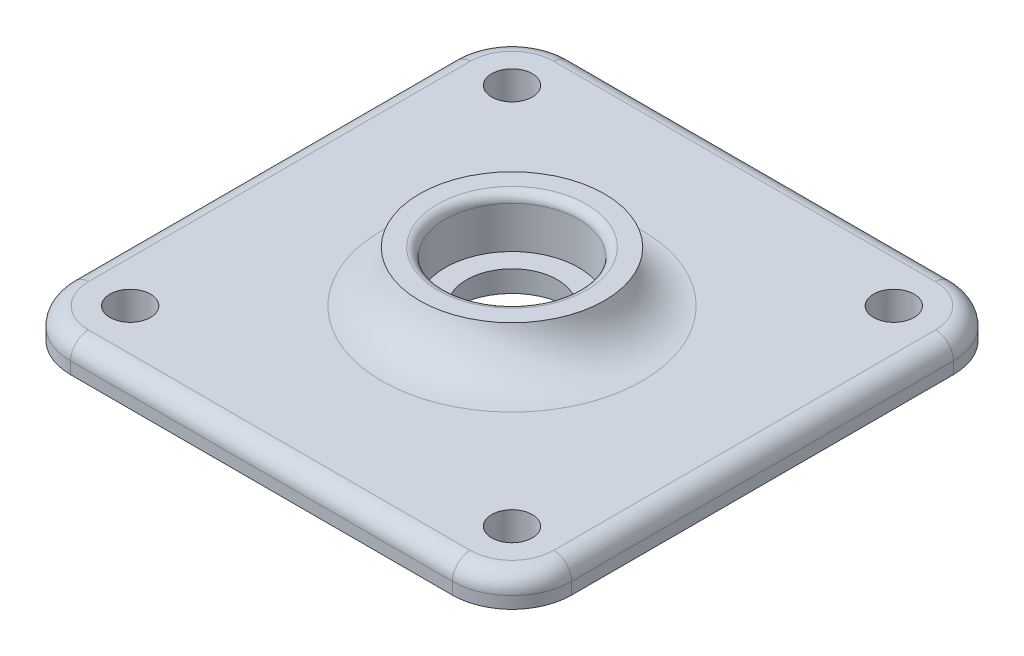
ISO-10303-21;
HEADER;
FILE_DESCRIPTION(('STEP AP214'),'2;1');
FILE_NAME('part.step','',(''),(''),'','','');
FILE_SCHEMA(('AUTOMOTIVE_DESIGN { 1 0 10303 214 1 1 1 1 }'));
ENDSEC;
DATA;
#1=APPLICATION_CONTEXT('core data for automotive mechanical design processes');
#2=APPLICATION_PROTOCOL_DEFINITION('international standard','automotive_design',2000,#1);
#3=PRODUCT_CONTEXT('',#1,'mechanical');
#4=PRODUCT('Part','Part','',(#3));
#5=PRODUCT_RELATED_PRODUCT_CATEGORY('part','',(#4));
#6=PRODUCT_DEFINITION_FORMATION('','',#4);
#7=PRODUCT_DEFINITION_CONTEXT('part definition',#1,'design');
#8=PRODUCT_DEFINITION('design','',#6,#7);
#9=PRODUCT_DEFINITION_SHAPE('','',#8);
#10=(LENGTH_UNIT() NAMED_UNIT(*) SI_UNIT(.MILLI.,.METRE.));
#11=(NAMED_UNIT(*) PLANE_ANGLE_UNIT() SI_UNIT($,.RADIAN.));
#12=(NAMED_UNIT(*) SI_UNIT($,.STERADIAN.) SOLID_ANGLE_UNIT());
#13=UNCERTAINTY_MEASURE_WITH_UNIT(LENGTH_MEASURE(1.E-05),#10,'distance_accuracy_value','');
#14=(GEOMETRIC_REPRESENTATION_CONTEXT(3) GLOBAL_UNCERTAINTY_ASSIGNED_CONTEXT((#13)) GLOBAL_UNIT_ASSIGNED_CONTEXT((#10,
#11,#12)) REPRESENTATION_CONTEXT('',''));
#15=CARTESIAN_POINT('',(0.,0.,0.));
#16=DIRECTION('',(0.,0.,1.));
#17=DIRECTION('',(1.,0.,0.));
#18=AXIS2_PLACEMENT_3D('',#15,#16,#17);
#19=CARTESIAN_POINT('',(32.,5.,-32.));
#20=DIRECTION('',(0.,-1.,0.));
#21=DIRECTION('',(0.,0.,-1.));
#22=AXIS2_PLACEMENT_3D('',#19,#20,#21);
#23=CYLINDRICAL_SURFACE('',#22,10.);
#24=DIRECTION('',(0.,-1.,0.));
#25=VECTOR('',#24,1.);
#26=CARTESIAN_POINT('',(32.,5.,-42.));
#27=LINE('',#26,#25);
#28=CARTESIAN_POINT('',(32.,2.,-42.));
#29=VERTEX_POINT('',#28);
#30=CARTESIAN_POINT('',(32.,0.,-42.));
#31=VERTEX_POINT('',#30);
#32=EDGE_CURVE('E187',#29,#31,#27,.T.);
#33=ORIENTED_EDGE('',*,*,#32,.F.);
#34=CARTESIAN_POINT('',(32.,2.,-32.));
#35=DIRECTION('',(0.,-1.,0.));
#36=DIRECTION('',(0.,0.,-1.));
#37=AXIS2_PLACEMENT_3D('',#34,#35,#36);
#38=CIRCLE('',#37,10.);
#39=CARTESIAN_POINT('',(42.,2.,-32.));
#40=VERTEX_POINT('',#39);
#41=EDGE_CURVE('E137',#29,#40,#38,.T.);
#42=ORIENTED_EDGE('',*,*,#41,.T.);
#43=DIRECTION('',(0.,-1.,0.));
#44=VECTOR('',#43,1.);
#45=CARTESIAN_POINT('',(42.,5.,-32.));
#46=LINE('',#45,#44);
#47=CARTESIAN_POINT('',(42.,0.,-32.));
#48=VERTEX_POINT('',#47);
#49=EDGE_CURVE('E131',#40,#48,#46,.T.);
#50=ORIENTED_EDGE('',*,*,#49,.T.);
#51=CARTESIAN_POINT('',(32.,0.,-32.));
#52=DIRECTION('',(0.,-1.,0.));
#53=DIRECTION('',(0.,0.,-1.));
#54=AXIS2_PLACEMENT_3D('',#51,#52,#53);
#55=CIRCLE('',#54,10.);
#56=EDGE_CURVE('E135',#31,#48,#55,.T.);
#57=ORIENTED_EDGE('',*,*,#56,.F.);
#58=EDGE_LOOP('',(#33,#42,#50,#57));
#59=FACE_BOUND('',#58,.T.);
#60=ADVANCED_FACE('F41',(#59),#23,.T.);
#61=CARTESIAN_POINT('',(32.,5.,-42.));
#62=DIRECTION('',(0.,0.,1.));
#63=DIRECTION('',(1.,0.,0.));
#64=AXIS2_PLACEMENT_3D('',#61,#62,#63);
#65=PLANE('',#64);
#66=DIRECTION('',(0.,-1.,0.));
#67=VECTOR('',#66,1.);
#68=CARTESIAN_POINT('',(-32.,5.,-42.));
#69=LINE('',#68,#67);
#70=CARTESIAN_POINT('',(-32.,2.,-42.));
#71=VERTEX_POINT('',#70);
#72=CARTESIAN_POINT('',(-32.,0.,-42.));
#73=VERTEX_POINT('',#72);
#74=EDGE_CURVE('E191',#71,#73,#69,.T.);
#75=ORIENTED_EDGE('',*,*,#74,.F.);
#76=DIRECTION('',(-1.,0.,0.));
#77=VECTOR('',#76,1.);
#78=CARTESIAN_POINT('',(32.,2.,-42.));
#79=LINE('',#78,#77);
#80=EDGE_CURVE('E238',#71,#29,#79,.F.);
#81=ORIENTED_EDGE('',*,*,#80,.T.);
#82=ORIENTED_EDGE('',*,*,#32,.T.);
#83=DIRECTION('',(-1.,0.,0.));
#84=VECTOR('',#83,1.);
#85=CARTESIAN_POINT('',(32.,0.,-42.));
#86=LINE('',#85,#84);
#87=EDGE_CURVE('E143',#31,#73,#86,.T.);
#88=ORIENTED_EDGE('',*,*,#87,.T.);
#89=EDGE_LOOP('',(#75,#81,#82,#88));
#90=FACE_BOUND('',#89,.T.);
#91=ADVANCED_FACE('F342',(#90),#65,.F.);
#92=CARTESIAN_POINT('',(-32.,5.,-32.));
#93=DIRECTION('',(0.,-1.,0.));
#94=DIRECTION('',(0.,0.,-1.));
#95=AXIS2_PLACEMENT_3D('',#92,#93,#94);
#96=CYLINDRICAL_SURFACE('',#95,10.);
#97=DIRECTION('',(0.,-1.,0.));
#98=VECTOR('',#97,1.);
#99=CARTESIAN_POINT('',(-42.,5.,-32.));
#100=LINE('',#99,#98);
#101=CARTESIAN_POINT('',(-42.,2.,-32.));
#102=VERTEX_POINT('',#101);
#103=CARTESIAN_POINT('',(-42.,0.,-32.));
#104=VERTEX_POINT('',#103);
#105=EDGE_CURVE('E194',#102,#104,#100,.T.);
#106=ORIENTED_EDGE('',*,*,#105,.F.);
#107=CARTESIAN_POINT('',(-32.,2.,-32.));
#108=DIRECTION('',(0.,-1.,0.));
#109=DIRECTION('',(0.,0.,-1.));
#110=AXIS2_PLACEMENT_3D('',#107,#108,#109);
#111=CIRCLE('',#110,10.);
#112=EDGE_CURVE('E241',#102,#71,#111,.T.);
#113=ORIENTED_EDGE('',*,*,#112,.T.);
#114=ORIENTED_EDGE('',*,*,#74,.T.);
#115=CARTESIAN_POINT('',(-32.,0.,-32.));
#116=DIRECTION('',(0.,1.,0.));
#117=DIRECTION('',(0.,0.,1.));
#118=AXIS2_PLACEMENT_3D('',#115,#116,#117);
#119=CIRCLE('',#118,10.);
#120=EDGE_CURVE('E181',#73,#104,#119,.T.);
#121=ORIENTED_EDGE('',*,*,#120,.T.);
#122=EDGE_LOOP('',(#106,#113,#114,#121));
#123=FACE_BOUND('',#122,.T.);
#124=ADVANCED_FACE('F347',(#123),#96,.T.);
#125=CARTESIAN_POINT('',(-42.,5.,-32.));
#126=DIRECTION('',(1.,0.,0.));
#127=DIRECTION('',(0.,0.,-1.));
#128=AXIS2_PLACEMENT_3D('',#125,#126,#127);
#129=PLANE('',#128);
#130=DIRECTION('',(0.,-1.,0.));
#131=VECTOR('',#130,1.);
#132=CARTESIAN_POINT('',(-42.,5.,32.));
#133=LINE('',#132,#131);
#134=CARTESIAN_POINT('',(-42.,2.,32.));
#135=VERTEX_POINT('',#134);
#136=CARTESIAN_POINT('',(-42.,0.,32.));
#137=VERTEX_POINT('',#136);
#138=EDGE_CURVE('E197',#135,#137,#133,.T.);
#139=ORIENTED_EDGE('',*,*,#138,.F.);
#140=DIRECTION('',(0.,0.,1.));
#141=VECTOR('',#140,1.);
#142=CARTESIAN_POINT('',(-42.,2.,-32.));
#143=LINE('',#142,#141);
#144=EDGE_CURVE('E244',#135,#102,#143,.F.);
#145=ORIENTED_EDGE('',*,*,#144,.T.);
#146=ORIENTED_EDGE('',*,*,#105,.T.);
#147=DIRECTION('',(0.,0.,1.));
#148=VECTOR('',#147,1.);
#149=CARTESIAN_POINT('',(-42.,0.,-32.));
#150=LINE('',#149,#148);
#151=EDGE_CURVE('E177',#104,#137,#150,.T.);
#152=ORIENTED_EDGE('',*,*,#151,.T.);
#153=EDGE_LOOP('',(#139,#145,#146,#152));
#154=FACE_BOUND('',#153,.T.);
#155=ADVANCED_FACE('F407',(#154),#129,.F.);
#156=CARTESIAN_POINT('',(-32.,5.,32.));
#157=DIRECTION('',(0.,-1.,0.));
#158=DIRECTION('',(0.,0.,-1.));
#159=AXIS2_PLACEMENT_3D('',#156,#157,#158);
#160=CYLINDRICAL_SURFACE('',#159,10.);
#161=DIRECTION('',(0.,-1.,0.));
#162=VECTOR('',#161,1.);
#163=CARTESIAN_POINT('',(-32.,5.,42.));
#164=LINE('',#163,#162);
#165=CARTESIAN_POINT('',(-32.,2.,42.));
#166=VERTEX_POINT('',#165);
#167=CARTESIAN_POINT('',(-32.,0.,42.));
#168=VERTEX_POINT('',#167);
#169=EDGE_CURVE('E200',#166,#168,#164,.T.);
#170=ORIENTED_EDGE('',*,*,#169,.F.);
#171=CARTESIAN_POINT('',(-32.,2.,32.));
#172=DIRECTION('',(0.,-1.,0.));
#173=DIRECTION('',(0.,0.,-1.));
#174=AXIS2_PLACEMENT_3D('',#171,#172,#173);
#175=CIRCLE('',#174,10.);
#176=EDGE_CURVE('E247',#166,#135,#175,.T.);
#177=ORIENTED_EDGE('',*,*,#176,.T.);
#178=ORIENTED_EDGE('',*,*,#138,.T.);
#179=CARTESIAN_POINT('',(-32.,0.,32.));
#180=DIRECTION('',(0.,-1.,0.));
#181=DIRECTION('',(0.,0.,-1.));
#182=AXIS2_PLACEMENT_3D('',#179,#180,#181);
#183=CIRCLE('',#182,10.);
#184=EDGE_CURVE('E173',#168,#137,#183,.T.);
#185=ORIENTED_EDGE('',*,*,#184,.F.);
#186=EDGE_LOOP('',(#170,#177,#178,#185));
#187=FACE_BOUND('',#186,.T.);
#188=ADVANCED_FACE('F410',(#187),#160,.T.);
#189=CARTESIAN_POINT('',(32.,5.,42.));
#190=DIRECTION('',(0.,0.,1.));
#191=DIRECTION('',(1.,0.,0.));
#192=AXIS2_PLACEMENT_3D('',#189,#190,#191);
#193=PLANE('',#192);
#194=DIRECTION('',(0.,-1.,0.));
#195=VECTOR('',#194,1.);
#196=CARTESIAN_POINT('',(32.,5.,42.));
#197=LINE('',#196,#195);
#198=CARTESIAN_POINT('',(32.,2.,42.));
#199=VERTEX_POINT('',#198);
#200=CARTESIAN_POINT('',(32.,0.,42.));
#201=VERTEX_POINT('',#200);
#202=EDGE_CURVE('E203',#199,#201,#197,.T.);
#203=ORIENTED_EDGE('',*,*,#202,.F.);
#204=DIRECTION('',(-1.,0.,0.));
#205=VECTOR('',#204,1.);
#206=CARTESIAN_POINT('',(-32.,2.,42.));
#207=LINE('',#206,#205);
#208=EDGE_CURVE('E51',#199,#166,#207,.T.);
#209=ORIENTED_EDGE('',*,*,#208,.T.);
#210=ORIENTED_EDGE('',*,*,#169,.T.);
#211=DIRECTION('',(-1.,0.,0.));
#212=VECTOR('',#211,1.);
#213=CARTESIAN_POINT('',(32.,0.,42.));
#214=LINE('',#213,#212);
#215=EDGE_CURVE('E169',#201,#168,#214,.T.);
#216=ORIENTED_EDGE('',*,*,#215,.F.);
#217=EDGE_LOOP('',(#203,#209,#210,#216));
#218=FACE_BOUND('',#217,.T.);
#219=ADVANCED_FACE('F418',(#218),#193,.T.);
#220=CARTESIAN_POINT('',(32.,5.,32.));
#221=DIRECTION('',(0.,-1.,0.));
#222=DIRECTION('',(0.,0.,-1.));
#223=AXIS2_PLACEMENT_3D('',#220,#221,#222);
#224=CYLINDRICAL_SURFACE('',#223,9.99999999999999);
#225=DIRECTION('',(0.,-1.,0.));
#226=VECTOR('',#225,1.);
#227=CARTESIAN_POINT('',(42.,5.,32.));
#228=LINE('',#227,#226);
#229=CARTESIAN_POINT('',(42.,2.,32.));
#230=VERTEX_POINT('',#229);
#231=CARTESIAN_POINT('',(42.,0.,32.));
#232=VERTEX_POINT('',#231);
#233=EDGE_CURVE('E142',#230,#232,#228,.T.);
#234=ORIENTED_EDGE('',*,*,#233,.F.);
#235=CARTESIAN_POINT('',(32.,2.,32.));
#236=DIRECTION('',(0.,-1.,0.));
#237=DIRECTION('',(0.,0.,-1.));
#238=AXIS2_PLACEMENT_3D('',#235,#236,#237);
#239=CIRCLE('',#238,9.99999999999999);
#240=EDGE_CURVE('E11',#230,#199,#239,.T.);
#241=ORIENTED_EDGE('',*,*,#240,.T.);
#242=ORIENTED_EDGE('',*,*,#202,.T.);
#243=CARTESIAN_POINT('',(32.,0.,32.));
#244=DIRECTION('',(0.,-1.,0.));
#245=DIRECTION('',(0.,0.,-1.));
#246=AXIS2_PLACEMENT_3D('',#243,#244,#245);
#247=CIRCLE('',#246,9.99999999999999);
#248=EDGE_CURVE('E152',#232,#201,#247,.T.);
#249=ORIENTED_EDGE('',*,*,#248,.F.);
#250=EDGE_LOOP('',(#234,#241,#242,#249));
#251=FACE_BOUND('',#250,.T.);
#252=ADVANCED_FACE('F416',(#251),#224,.T.);
#253=CARTESIAN_POINT('',(42.,5.,-32.));
#254=DIRECTION('',(1.,0.,0.));
#255=DIRECTION('',(0.,0.,-1.));
#256=AXIS2_PLACEMENT_3D('',#253,#254,#255);
#257=PLANE('',#256);
#258=ORIENTED_EDGE('',*,*,#49,.F.);
#259=DIRECTION('',(0.,0.,1.));
#260=VECTOR('',#259,1.);
#261=CARTESIAN_POINT('',(42.,2.,32.));
#262=LINE('',#261,#260);
#263=EDGE_CURVE('E208',#40,#230,#262,.T.);
#264=ORIENTED_EDGE('',*,*,#263,.T.);
#265=ORIENTED_EDGE('',*,*,#233,.T.);
#266=DIRECTION('',(0.,0.,1.));
#267=VECTOR('',#266,1.);
#268=CARTESIAN_POINT('',(42.,0.,-32.));
#269=LINE('',#268,#267);
#270=EDGE_CURVE('E146',#48,#232,#269,.T.);
#271=ORIENTED_EDGE('',*,*,#270,.F.);
#272=EDGE_LOOP('',(#258,#264,#265,#271));
#273=FACE_BOUND('',#272,.T.);
#274=ADVANCED_FACE('F147',(#273),#257,.T.);
#275=CARTESIAN_POINT('',(32.,5.,-32.));
#276=DIRECTION('',(0.,-1.,0.));
#277=DIRECTION('',(0.,0.,-1.));
#278=AXIS2_PLACEMENT_3D('',#275,#276,#277);
#279=PLANE('',#278);
#280=CARTESIAN_POINT('',(-32.,5.,-32.));
#281=DIRECTION('',(0.,1.,0.));
#282=DIRECTION('',(0.,0.,1.));
#283=AXIS2_PLACEMENT_3D('',#280,#281,#282);
#284=CIRCLE('',#283,3.4);
#285=CARTESIAN_POINT('',(-32.,5.,-28.6));
#286=VERTEX_POINT('',#285);
#287=EDGE_CURVE('E636',#286,#286,#284,.T.);
#288=ORIENTED_EDGE('',*,*,#287,.F.);
#289=EDGE_LOOP('',(#288));
#290=FACE_BOUND('',#289,.T.);
#291=CARTESIAN_POINT('',(-32.,5.,32.));
#292=DIRECTION('',(0.,1.,0.));
#293=DIRECTION('',(0.,0.,1.));
#294=AXIS2_PLACEMENT_3D('',#291,#292,#293);
#295=CIRCLE('',#294,3.4);
#296=CARTESIAN_POINT('',(-32.,5.,35.4));
#297=VERTEX_POINT('',#296);
#298=EDGE_CURVE('E640',#297,#297,#295,.T.);
#299=ORIENTED_EDGE('',*,*,#298,.F.);
#300=EDGE_LOOP('',(#299));
#301=FACE_BOUND('',#300,.T.);
#302=CARTESIAN_POINT('',(32.,5.,32.));
#303=DIRECTION('',(0.,1.,0.));
#304=DIRECTION('',(0.,0.,1.));
#305=AXIS2_PLACEMENT_3D('',#302,#303,#304);
#306=CIRCLE('',#305,3.4);
#307=CARTESIAN_POINT('',(32.,5.,35.4));
#308=VERTEX_POINT('',#307);
#309=EDGE_CURVE('E650',#308,#308,#306,.T.);
#310=ORIENTED_EDGE('',*,*,#309,.F.);
#311=EDGE_LOOP('',(#310));
#312=FACE_BOUND('',#311,.T.);
#313=CARTESIAN_POINT('',(32.,5.,-32.));
#314=DIRECTION('',(0.,1.,0.));
#315=DIRECTION('',(0.,0.,1.));
#316=AXIS2_PLACEMENT_3D('',#313,#314,#315);
#317=CIRCLE('',#316,3.4);
#318=CARTESIAN_POINT('',(32.,5.,-28.6));
#319=VERTEX_POINT('',#318);
#320=EDGE_CURVE('E657',#319,#319,#317,.T.);
#321=ORIENTED_EDGE('',*,*,#320,.F.);
#322=EDGE_LOOP('',(#321));
#323=FACE_BOUND('',#322,.T.);
#324=CARTESIAN_POINT('',(32.,5.,32.));
#325=DIRECTION('',(0.,-1.,0.));
#326=DIRECTION('',(0.,0.,-1.));
#327=AXIS2_PLACEMENT_3D('',#324,#325,#326);
#328=CIRCLE('',#327,6.99999999999999);
#329=CARTESIAN_POINT('',(32.,5.,39.));
#330=VERTEX_POINT('',#329);
#331=CARTESIAN_POINT('',(39.,5.,32.));
#332=VERTEX_POINT('',#331);
#333=EDGE_CURVE('E211',#330,#332,#328,.F.);
#334=ORIENTED_EDGE('',*,*,#333,.T.);
#335=DIRECTION('',(0.,0.,1.));
#336=VECTOR('',#335,1.);
#337=CARTESIAN_POINT('',(39.,5.,-32.));
#338=LINE('',#337,#336);
#339=CARTESIAN_POINT('',(39.,5.,-32.));
#340=VERTEX_POINT('',#339);
#341=EDGE_CURVE('E232',#332,#340,#338,.F.);
#342=ORIENTED_EDGE('',*,*,#341,.T.);
#343=CARTESIAN_POINT('',(32.,5.,-32.));
#344=DIRECTION('',(0.,-1.,0.));
#345=DIRECTION('',(0.,0.,-1.));
#346=AXIS2_PLACEMENT_3D('',#343,#344,#345);
#347=CIRCLE('',#346,7.);
#348=CARTESIAN_POINT('',(32.,5.,-39.));
#349=VERTEX_POINT('',#348);
#350=EDGE_CURVE('E229',#340,#349,#347,.F.);
#351=ORIENTED_EDGE('',*,*,#350,.T.);
#352=DIRECTION('',(-1.,0.,0.));
#353=VECTOR('',#352,1.);
#354=CARTESIAN_POINT('',(32.,5.,-39.));
#355=LINE('',#354,#353);
#356=CARTESIAN_POINT('',(-32.,5.,-39.));
#357=VERTEX_POINT('',#356);
#358=EDGE_CURVE('E226',#349,#357,#355,.T.);
#359=ORIENTED_EDGE('',*,*,#358,.T.);
#360=CARTESIAN_POINT('',(-32.,5.,-32.));
#361=DIRECTION('',(0.,-1.,0.));
#362=DIRECTION('',(0.,0.,-1.));
#363=AXIS2_PLACEMENT_3D('',#360,#361,#362);
#364=CIRCLE('',#363,7.);
#365=CARTESIAN_POINT('',(-39.,5.,-32.));
#366=VERTEX_POINT('',#365);
#367=EDGE_CURVE('E223',#357,#366,#364,.F.);
#368=ORIENTED_EDGE('',*,*,#367,.T.);
#369=DIRECTION('',(0.,0.,1.));
#370=VECTOR('',#369,1.);
#371=CARTESIAN_POINT('',(-39.,5.,-32.));
#372=LINE('',#371,#370);
#373=CARTESIAN_POINT('',(-39.,5.,32.));
#374=VERTEX_POINT('',#373);
#375=EDGE_CURVE('E220',#366,#374,#372,.T.);
#376=ORIENTED_EDGE('',*,*,#375,.T.);
#377=CARTESIAN_POINT('',(-32.,5.,32.));
#378=DIRECTION('',(0.,-1.,0.));
#379=DIRECTION('',(0.,0.,-1.));
#380=AXIS2_PLACEMENT_3D('',#377,#378,#379);
#381=CIRCLE('',#380,7.);
#382=CARTESIAN_POINT('',(-32.,5.,39.));
#383=VERTEX_POINT('',#382);
#384=EDGE_CURVE('E217',#374,#383,#381,.F.);
#385=ORIENTED_EDGE('',*,*,#384,.T.);
#386=DIRECTION('',(-1.,0.,0.));
#387=VECTOR('',#386,1.);
#388=CARTESIAN_POINT('',(32.,5.,39.));
#389=LINE('',#388,#387);
#390=EDGE_CURVE('E214',#383,#330,#389,.F.);
#391=ORIENTED_EDGE('',*,*,#390,.T.);
#392=EDGE_LOOP('',(#334,#342,#351,#359,#368,#376,#385,#391));
#393=FACE_BOUND('',#392,.T.);
#394=CARTESIAN_POINT('',(0.,5.,0.));
#395=DIRECTION('',(0.,1.,0.));
#396=DIRECTION('',(0.,0.,1.));
#397=AXIS2_PLACEMENT_3D('',#394,#395,#396);
#398=CIRCLE('',#397,21.830169384182);
#399=CARTESIAN_POINT('',(0.,5.,21.830169384182));
#400=VERTEX_POINT('',#399);
#401=EDGE_CURVE('E190',#400,#400,#398,.T.);
#402=ORIENTED_EDGE('',*,*,#401,.F.);
#403=EDGE_LOOP('',(#402));
#404=FACE_BOUND('',#403,.T.);
#405=ADVANCED_FACE('F394',(#290,#301,#312,#323,#393,#404),#279,.F.);
#406=CARTESIAN_POINT('',(32.,0.,-32.));
#407=DIRECTION('',(0.,-1.,0.));
#408=DIRECTION('',(0.,0.,-1.));
#409=AXIS2_PLACEMENT_3D('',#406,#407,#408);
#410=PLANE('',#409);
#411=CARTESIAN_POINT('',(-32.,0.,-32.));
#412=DIRECTION('',(0.,-1.,0.));
#413=DIRECTION('',(0.,0.,-1.));
#414=AXIS2_PLACEMENT_3D('',#411,#412,#413);
#415=CIRCLE('',#414,3.4);
#416=CARTESIAN_POINT('',(-32.,0.,-35.4));
#417=VERTEX_POINT('',#416);
#418=EDGE_CURVE('E633',#417,#417,#415,.T.);
#419=ORIENTED_EDGE('',*,*,#418,.F.);
#420=EDGE_LOOP('',(#419));
#421=FACE_BOUND('',#420,.T.);
#422=CARTESIAN_POINT('',(-32.,0.,32.));
#423=DIRECTION('',(0.,-1.,0.));
#424=DIRECTION('',(0.,0.,-1.));
#425=AXIS2_PLACEMENT_3D('',#422,#423,#424);
#426=CIRCLE('',#425,3.4);
#427=CARTESIAN_POINT('',(-32.,0.,28.6));
#428=VERTEX_POINT('',#427);
#429=EDGE_CURVE('E646',#428,#428,#426,.T.);
#430=ORIENTED_EDGE('',*,*,#429,.F.);
#431=EDGE_LOOP('',(#430));
#432=FACE_BOUND('',#431,.T.);
#433=CARTESIAN_POINT('',(32.,0.,32.));
#434=DIRECTION('',(0.,-1.,0.));
#435=DIRECTION('',(0.,0.,-1.));
#436=AXIS2_PLACEMENT_3D('',#433,#434,#435);
#437=CIRCLE('',#436,3.4);
#438=CARTESIAN_POINT('',(32.,0.,28.6));
#439=VERTEX_POINT('',#438);
#440=EDGE_CURVE('E654',#439,#439,#437,.T.);
#441=ORIENTED_EDGE('',*,*,#440,.F.);
#442=EDGE_LOOP('',(#441));
#443=FACE_BOUND('',#442,.T.);
#444=CARTESIAN_POINT('',(32.,0.,-32.));
#445=DIRECTION('',(0.,-1.,0.));
#446=DIRECTION('',(0.,0.,-1.));
#447=AXIS2_PLACEMENT_3D('',#444,#445,#446);
#448=CIRCLE('',#447,3.4);
#449=CARTESIAN_POINT('',(32.,0.,-35.4));
#450=VERTEX_POINT('',#449);
#451=EDGE_CURVE('E256',#450,#450,#448,.T.);
#452=ORIENTED_EDGE('',*,*,#451,.F.);
#453=EDGE_LOOP('',(#452));
#454=FACE_BOUND('',#453,.T.);
#455=CARTESIAN_POINT('',(0.,0.,0.));
#456=DIRECTION('',(0.,1.,0.));
#457=DIRECTION('',(0.,0.,1.));
#458=AXIS2_PLACEMENT_3D('',#455,#456,#457);
#459=CIRCLE('',#458,9.6);
#460=CARTESIAN_POINT('',(0.,0.,9.6));
#461=VERTEX_POINT('',#460);
#462=EDGE_CURVE('E290',#461,#461,#459,.T.);
#463=ORIENTED_EDGE('',*,*,#462,.T.);
#464=EDGE_LOOP('',(#463));
#465=FACE_BOUND('',#464,.T.);
#466=ORIENTED_EDGE('',*,*,#56,.T.);
#467=ORIENTED_EDGE('',*,*,#270,.T.);
#468=ORIENTED_EDGE('',*,*,#248,.T.);
#469=ORIENTED_EDGE('',*,*,#215,.T.);
#470=ORIENTED_EDGE('',*,*,#184,.T.);
#471=ORIENTED_EDGE('',*,*,#151,.F.);
#472=ORIENTED_EDGE('',*,*,#120,.F.);
#473=ORIENTED_EDGE('',*,*,#87,.F.);
#474=EDGE_LOOP('',(#466,#467,#468,#469,#470,#471,#472,#473));
#475=FACE_BOUND('',#474,.T.);
#476=ADVANCED_FACE('F155',(#421,#432,#443,#454,#465,#475),#410,.T.);
#477=CARTESIAN_POINT('',(0.,0.,0.));
#478=DIRECTION('',(0.,1.,0.));
#479=DIRECTION('',(0.,0.,1.));
#480=AXIS2_PLACEMENT_3D('',#477,#478,#479);
#481=CYLINDRICAL_SURFACE('',#480,11.15);
#482=CARTESIAN_POINT('',(0.,5.00000000000001,0.));
#483=DIRECTION('',(0.,1.,0.));
#484=DIRECTION('',(0.,0.,1.));
#485=AXIS2_PLACEMENT_3D('',#482,#483,#484);
#486=CIRCLE('',#485,11.15);
#487=CARTESIAN_POINT('',(0.,5.00000000000001,11.15));
#488=VERTEX_POINT('',#487);
#489=EDGE_CURVE('E304',#488,#488,#486,.T.);
#490=ORIENTED_EDGE('',*,*,#489,.F.);
#491=EDGE_LOOP('',(#490));
#492=FACE_BOUND('',#491,.T.);
#493=CARTESIAN_POINT('',(0.,12.,0.));
#494=DIRECTION('',(0.,1.,0.));
#495=DIRECTION('',(0.,0.,1.));
#496=AXIS2_PLACEMENT_3D('',#493,#494,#495);
#497=CIRCLE('',#496,11.15);
#498=CARTESIAN_POINT('',(0.,12.,11.15));
#499=VERTEX_POINT('',#498);
#500=EDGE_CURVE('E159',#499,#499,#497,.T.);
#501=ORIENTED_EDGE('',*,*,#500,.T.);
#502=EDGE_LOOP('',(#501));
#503=FACE_BOUND('',#502,.T.);
#504=ADVANCED_FACE('F433',(#492,#503),#481,.F.);
#505=CARTESIAN_POINT('',(0.,12.,0.));
#506=DIRECTION('',(0.,1.,0.));
#507=DIRECTION('',(0.,0.,1.));
#508=AXIS2_PLACEMENT_3D('',#505,#506,#507);
#509=TOROIDAL_SURFACE('',#508,12.6583333333333,1.50833333333334);
#510=ORIENTED_EDGE('',*,*,#500,.F.);
#511=EDGE_LOOP('',(#510));
#512=FACE_BOUND('',#511,.T.);
#513=CARTESIAN_POINT('',(0.,13.5,0.));
#514=DIRECTION('',(0.,1.,0.));
#515=DIRECTION('',(0.,0.,1.));
#516=AXIS2_PLACEMENT_3D('',#513,#514,#515);
#517=CIRCLE('',#516,12.5);
#518=CARTESIAN_POINT('',(0.,13.5,12.5));
#519=VERTEX_POINT('',#518);
#520=EDGE_CURVE('E163',#519,#519,#517,.T.);
#521=ORIENTED_EDGE('',*,*,#520,.T.);
#522=EDGE_LOOP('',(#521));
#523=FACE_BOUND('',#522,.T.);
#524=ADVANCED_FACE('F322',(#512,#523),#509,.T.);
#525=CARTESIAN_POINT('',(0.,13.5,0.));
#526=DIRECTION('',(0.,-1.,0.));
#527=DIRECTION('',(0.,0.,-1.));
#528=AXIS2_PLACEMENT_3D('',#525,#526,#527);
#529=PLANE('',#528);
#530=ORIENTED_EDGE('',*,*,#520,.F.);
#531=EDGE_LOOP('',(#530));
#532=FACE_BOUND('',#531,.T.);
#533=CARTESIAN_POINT('',(0.,13.5,0.));
#534=DIRECTION('',(0.,1.,0.));
#535=DIRECTION('',(0.,0.,1.));
#536=AXIS2_PLACEMENT_3D('',#533,#534,#535);
#537=CIRCLE('',#536,15.5);
#538=CARTESIAN_POINT('',(0.,13.5,15.5));
#539=VERTEX_POINT('',#538);
#540=EDGE_CURVE('E315',#539,#539,#537,.T.);
#541=ORIENTED_EDGE('',*,*,#540,.T.);
#542=EDGE_LOOP('',(#541));
#543=FACE_BOUND('',#542,.T.);
#544=ADVANCED_FACE('F324',(#532,#543),#529,.F.);
#545=CARTESIAN_POINT('',(0.,9.75000000000001,0.));
#546=DIRECTION('',(0.,1.,0.));
#547=DIRECTION('',(0.,0.,1.));
#548=AXIS2_PLACEMENT_3D('',#545,#546,#547);
#549=TOROIDAL_SURFACE('',#548,15.5,3.75);
#550=CARTESIAN_POINT('',(0.,12.,0.));
#551=DIRECTION('',(0.,1.,0.));
#552=DIRECTION('',(0.,0.,1.));
#553=AXIS2_PLACEMENT_3D('',#550,#551,#552);
#554=CIRCLE('',#553,12.5);
#555=CARTESIAN_POINT('',(0.,12.,12.5));
#556=VERTEX_POINT('',#555);
#557=EDGE_CURVE('E308',#556,#556,#554,.T.);
#558=ORIENTED_EDGE('',*,*,#557,.T.);
#559=EDGE_LOOP('',(#558));
#560=FACE_BOUND('',#559,.T.);
#561=ORIENTED_EDGE('',*,*,#540,.F.);
#562=EDGE_LOOP('',(#561));
#563=FACE_BOUND('',#562,.T.);
#564=ADVANCED_FACE('F327',(#560,#563),#549,.F.);
#565=CARTESIAN_POINT('',(0.,14.9977965354125,0.));
#566=DIRECTION('',(0.,1.,0.));
#567=DIRECTION('',(0.,0.,1.));
#568=AXIS2_PLACEMENT_3D('',#565,#566,#567);
#569=TOROIDAL_SURFACE('',#568,22.040084692091,10.);
#570=ORIENTED_EDGE('',*,*,#401,.T.);
#571=EDGE_LOOP('',(#570));
#572=FACE_BOUND('',#571,.T.);
#573=ORIENTED_EDGE('',*,*,#557,.F.);
#574=EDGE_LOOP('',(#573));
#575=FACE_BOUND('',#574,.T.);
#576=ADVANCED_FACE('F332',(#572,#575),#569,.F.);
#577=CARTESIAN_POINT('',(0.,5.,0.));
#578=DIRECTION('',(0.,1.,0.));
#579=DIRECTION('',(0.,0.,1.));
#580=AXIS2_PLACEMENT_3D('',#577,#578,#579);
#581=CIRCLE('',#580,7.6);
#582=CARTESIAN_POINT('',(0.,5.,7.6));
#583=VERTEX_POINT('',#582);
#584=EDGE_CURVE('E283',#583,#583,#581,.T.);
#585=ORIENTED_EDGE('',*,*,#584,.F.);
#586=EDGE_LOOP('',(#585));
#587=FACE_BOUND('',#586,.T.);
#588=ORIENTED_EDGE('',*,*,#489,.T.);
#589=EDGE_LOOP('',(#588));
#590=FACE_BOUND('',#589,.T.);
#591=ADVANCED_FACE('F338',(#587,#590),#279,.F.);
#592=CARTESIAN_POINT('',(0.,2.00869631555949,0.));
#593=DIRECTION('',(0.,1.,0.));
#594=DIRECTION('',(0.,0.,1.));
#595=AXIS2_PLACEMENT_3D('',#592,#593,#594);
#596=TOROIDAL_SURFACE('',#595,7.37174078889871,3.);
#597=ORIENTED_EDGE('',*,*,#584,.T.);
#598=EDGE_LOOP('',(#597));
#599=FACE_BOUND('',#598,.T.);
#600=CARTESIAN_POINT('',(0.,4.01739263111897,0.));
#601=DIRECTION('',(0.,1.,0.));
#602=DIRECTION('',(0.,0.,1.));
#603=AXIS2_PLACEMENT_3D('',#600,#601,#602);
#604=CIRCLE('',#603,9.6);
#605=CARTESIAN_POINT('',(0.,4.01739263111897,9.6));
#606=VERTEX_POINT('',#605);
#607=EDGE_CURVE('E296',#606,#606,#604,.T.);
#608=ORIENTED_EDGE('',*,*,#607,.F.);
#609=EDGE_LOOP('',(#608));
#610=FACE_BOUND('',#609,.T.);
#611=ADVANCED_FACE('F386',(#599,#610),#596,.F.);
#612=CARTESIAN_POINT('',(0.,0.,0.));
#613=DIRECTION('',(0.,1.,0.));
#614=DIRECTION('',(0.,0.,1.));
#615=AXIS2_PLACEMENT_3D('',#612,#613,#614);
#616=CYLINDRICAL_SURFACE('',#615,9.6);
#617=ORIENTED_EDGE('',*,*,#462,.F.);
#618=EDGE_LOOP('',(#617));
#619=FACE_BOUND('',#618,.T.);
#620=ORIENTED_EDGE('',*,*,#607,.T.);
#621=EDGE_LOOP('',(#620));
#622=FACE_BOUND('',#621,.T.);
#623=ADVANCED_FACE('F381',(#619,#622),#616,.F.);
#624=CARTESIAN_POINT('',(-39.,2.,-32.));
#625=DIRECTION('',(0.,0.,1.));
#626=DIRECTION('',(1.,0.,0.));
#627=AXIS2_PLACEMENT_3D('',#624,#625,#626);
#628=CYLINDRICAL_SURFACE('',#627,3.);
#629=CARTESIAN_POINT('',(-39.,2.,32.));
#630=DIRECTION('',(0.,0.,1.));
#631=DIRECTION('',(1.,0.,0.));
#632=AXIS2_PLACEMENT_3D('',#629,#630,#631);
#633=CIRCLE('',#632,3.);
#634=EDGE_CURVE('E274',#374,#135,#633,.T.);
#635=ORIENTED_EDGE('',*,*,#634,.F.);
#636=ORIENTED_EDGE('',*,*,#375,.F.);
#637=CARTESIAN_POINT('',(-39.,2.,-32.));
#638=DIRECTION('',(0.,0.,-1.));
#639=DIRECTION('',(-1.,0.,0.));
#640=AXIS2_PLACEMENT_3D('',#637,#638,#639);
#641=CIRCLE('',#640,3.);
#642=EDGE_CURVE('E45',#102,#366,#641,.T.);
#643=ORIENTED_EDGE('',*,*,#642,.F.);
#644=ORIENTED_EDGE('',*,*,#144,.F.);
#645=EDGE_LOOP('',(#635,#636,#643,#644));
#646=FACE_BOUND('',#645,.T.);
#647=ADVANCED_FACE('F43',(#646),#628,.T.);
#648=CARTESIAN_POINT('',(-32.,2.,-32.));
#649=DIRECTION('',(0.,-1.,0.));
#650=DIRECTION('',(0.,0.,-1.));
#651=AXIS2_PLACEMENT_3D('',#648,#649,#650);
#652=TOROIDAL_SURFACE('',#651,7.,3.);
#653=ORIENTED_EDGE('',*,*,#642,.T.);
#654=ORIENTED_EDGE('',*,*,#367,.F.);
#655=CARTESIAN_POINT('',(-32.,2.,-39.));
#656=DIRECTION('',(1.,0.,0.));
#657=DIRECTION('',(0.,0.,-1.));
#658=AXIS2_PLACEMENT_3D('',#655,#656,#657);
#659=CIRCLE('',#658,3.);
#660=EDGE_CURVE('E271',#71,#357,#659,.T.);
#661=ORIENTED_EDGE('',*,*,#660,.F.);
#662=ORIENTED_EDGE('',*,*,#112,.F.);
#663=EDGE_LOOP('',(#653,#654,#661,#662));
#664=FACE_BOUND('',#663,.T.);
#665=ADVANCED_FACE('F376',(#664),#652,.T.);
#666=CARTESIAN_POINT('',(-32.,2.,32.));
#667=DIRECTION('',(0.,-1.,0.));
#668=DIRECTION('',(0.,0.,-1.));
#669=AXIS2_PLACEMENT_3D('',#666,#667,#668);
#670=TOROIDAL_SURFACE('',#669,7.,3.);
#671=ORIENTED_EDGE('',*,*,#634,.T.);
#672=ORIENTED_EDGE('',*,*,#176,.F.);
#673=CARTESIAN_POINT('',(-32.,2.,39.));
#674=DIRECTION('',(1.,0.,0.));
#675=DIRECTION('',(0.,0.,-1.));
#676=AXIS2_PLACEMENT_3D('',#673,#674,#675);
#677=CIRCLE('',#676,3.);
#678=EDGE_CURVE('E267',#383,#166,#677,.T.);
#679=ORIENTED_EDGE('',*,*,#678,.F.);
#680=ORIENTED_EDGE('',*,*,#384,.F.);
#681=EDGE_LOOP('',(#671,#672,#679,#680));
#682=FACE_BOUND('',#681,.T.);
#683=ADVANCED_FACE('F373',(#682),#670,.T.);
#684=CARTESIAN_POINT('',(32.,2.,-39.));
#685=DIRECTION('',(-1.,0.,0.));
#686=DIRECTION('',(0.,0.,1.));
#687=AXIS2_PLACEMENT_3D('',#684,#685,#686);
#688=CYLINDRICAL_SURFACE('',#687,3.);
#689=ORIENTED_EDGE('',*,*,#660,.T.);
#690=ORIENTED_EDGE('',*,*,#358,.F.);
#691=CARTESIAN_POINT('',(32.,2.,-39.));
#692=DIRECTION('',(1.,0.,0.));
#693=DIRECTION('',(0.,0.,-1.));
#694=AXIS2_PLACEMENT_3D('',#691,#692,#693);
#695=CIRCLE('',#694,3.);
#696=EDGE_CURVE('E263',#29,#349,#695,.T.);
#697=ORIENTED_EDGE('',*,*,#696,.F.);
#698=ORIENTED_EDGE('',*,*,#80,.F.);
#699=EDGE_LOOP('',(#689,#690,#697,#698));
#700=FACE_BOUND('',#699,.T.);
#701=ADVANCED_FACE('F369',(#700),#688,.T.);
#702=CARTESIAN_POINT('',(32.,2.,39.));
#703=DIRECTION('',(1.,0.,0.));
#704=DIRECTION('',(0.,0.,-1.));
#705=AXIS2_PLACEMENT_3D('',#702,#703,#704);
#706=CYLINDRICAL_SURFACE('',#705,3.);
#707=ORIENTED_EDGE('',*,*,#678,.T.);
#708=ORIENTED_EDGE('',*,*,#208,.F.);
#709=CARTESIAN_POINT('',(32.,2.,39.));
#710=DIRECTION('',(1.,0.,0.));
#711=DIRECTION('',(0.,0.,-1.));
#712=AXIS2_PLACEMENT_3D('',#709,#710,#711);
#713=CIRCLE('',#712,3.);
#714=EDGE_CURVE('E259',#330,#199,#713,.T.);
#715=ORIENTED_EDGE('',*,*,#714,.F.);
#716=ORIENTED_EDGE('',*,*,#390,.F.);
#717=EDGE_LOOP('',(#707,#708,#715,#716));
#718=FACE_BOUND('',#717,.T.);
#719=ADVANCED_FACE('F365',(#718),#706,.T.);
#720=CARTESIAN_POINT('',(32.,2.,-32.));
#721=DIRECTION('',(0.,-1.,0.));
#722=DIRECTION('',(0.,0.,-1.));
#723=AXIS2_PLACEMENT_3D('',#720,#721,#722);
#724=TOROIDAL_SURFACE('',#723,7.,3.);
#725=ORIENTED_EDGE('',*,*,#696,.T.);
#726=ORIENTED_EDGE('',*,*,#350,.F.);
#727=CARTESIAN_POINT('',(39.,2.,-32.));
#728=DIRECTION('',(0.,0.,1.));
#729=DIRECTION('',(1.,0.,0.));
#730=AXIS2_PLACEMENT_3D('',#727,#728,#729);
#731=CIRCLE('',#730,3.);
#732=EDGE_CURVE('E255',#40,#340,#731,.T.);
#733=ORIENTED_EDGE('',*,*,#732,.F.);
#734=ORIENTED_EDGE('',*,*,#41,.F.);
#735=EDGE_LOOP('',(#725,#726,#733,#734));
#736=FACE_BOUND('',#735,.T.);
#737=ADVANCED_FACE('F361',(#736),#724,.T.);
#738=CARTESIAN_POINT('',(32.,2.,32.));
#739=DIRECTION('',(0.,-1.,0.));
#740=DIRECTION('',(0.,0.,-1.));
#741=AXIS2_PLACEMENT_3D('',#738,#739,#740);
#742=TOROIDAL_SURFACE('',#741,6.99999999999999,3.);
#743=ORIENTED_EDGE('',*,*,#714,.T.);
#744=ORIENTED_EDGE('',*,*,#240,.F.);
#745=CARTESIAN_POINT('',(39.,2.,32.));
#746=DIRECTION('',(0.,0.,-1.));
#747=DIRECTION('',(-1.,0.,0.));
#748=AXIS2_PLACEMENT_3D('',#745,#746,#747);
#749=CIRCLE('',#748,3.);
#750=EDGE_CURVE('E252',#332,#230,#749,.T.);
#751=ORIENTED_EDGE('',*,*,#750,.F.);
#752=ORIENTED_EDGE('',*,*,#333,.F.);
#753=EDGE_LOOP('',(#743,#744,#751,#752));
#754=FACE_BOUND('',#753,.T.);
#755=ADVANCED_FACE('F357',(#754),#742,.T.);
#756=CARTESIAN_POINT('',(39.,2.,-32.));
#757=DIRECTION('',(0.,0.,-1.));
#758=DIRECTION('',(-1.,0.,0.));
#759=AXIS2_PLACEMENT_3D('',#756,#757,#758);
#760=CYLINDRICAL_SURFACE('',#759,3.);
#761=ORIENTED_EDGE('',*,*,#732,.T.);
#762=ORIENTED_EDGE('',*,*,#341,.F.);
#763=ORIENTED_EDGE('',*,*,#750,.T.);
#764=ORIENTED_EDGE('',*,*,#263,.F.);
#765=EDGE_LOOP('',(#761,#762,#763,#764));
#766=FACE_BOUND('',#765,.T.);
#767=ADVANCED_FACE('F353',(#766),#760,.T.);
#768=CARTESIAN_POINT('',(32.,5.,-32.));
#769=DIRECTION('',(0.,1.,0.));
#770=DIRECTION('',(0.,0.,1.));
#771=AXIS2_PLACEMENT_3D('',#768,#769,#770);
#772=CYLINDRICAL_SURFACE('',#771,3.4);
#773=ORIENTED_EDGE('',*,*,#451,.T.);
#774=EDGE_LOOP('',(#773));
#775=FACE_BOUND('',#774,.T.);
#776=ORIENTED_EDGE('',*,*,#320,.T.);
#777=EDGE_LOOP('',(#776));
#778=FACE_BOUND('',#777,.T.);
#779=ADVANCED_FACE('F356',(#775,#778),#772,.F.);
#780=CARTESIAN_POINT('',(32.,5.,32.));
#781=DIRECTION('',(0.,1.,0.));
#782=DIRECTION('',(0.,0.,1.));
#783=AXIS2_PLACEMENT_3D('',#780,#781,#782);
#784=CYLINDRICAL_SURFACE('',#783,3.4);
#785=ORIENTED_EDGE('',*,*,#440,.T.);
#786=EDGE_LOOP('',(#785));
#787=FACE_BOUND('',#786,.T.);
#788=ORIENTED_EDGE('',*,*,#309,.T.);
#789=EDGE_LOOP('',(#788));
#790=FACE_BOUND('',#789,.T.);
#791=ADVANCED_FACE('F596',(#787,#790),#784,.F.);
#792=CARTESIAN_POINT('',(-32.,5.,32.));
#793=DIRECTION('',(0.,1.,0.));
#794=DIRECTION('',(0.,0.,1.));
#795=AXIS2_PLACEMENT_3D('',#792,#793,#794);
#796=CYLINDRICAL_SURFACE('',#795,3.4);
#797=ORIENTED_EDGE('',*,*,#429,.T.);
#798=EDGE_LOOP('',(#797));
#799=FACE_BOUND('',#798,.T.);
#800=ORIENTED_EDGE('',*,*,#298,.T.);
#801=EDGE_LOOP('',(#800));
#802=FACE_BOUND('',#801,.T.);
#803=ADVANCED_FACE('F606',(#799,#802),#796,.F.);
#804=CARTESIAN_POINT('',(-32.,5.,-32.));
#805=DIRECTION('',(0.,1.,0.));
#806=DIRECTION('',(0.,0.,1.));
#807=AXIS2_PLACEMENT_3D('',#804,#805,#806);
#808=CYLINDRICAL_SURFACE('',#807,3.4);
#809=ORIENTED_EDGE('',*,*,#418,.T.);
#810=EDGE_LOOP('',(#809));
#811=FACE_BOUND('',#810,.T.);
#812=ORIENTED_EDGE('',*,*,#287,.T.);
#813=EDGE_LOOP('',(#812));
#814=FACE_BOUND('',#813,.T.);
#815=ADVANCED_FACE('F616',(#811,#814),#808,.F.);
#816=CLOSED_SHELL('',(#60,#91,#124,#155,#188,#219,#252,#274,#405,#476,#504,#524,#544,#564,#576,
#591,#611,#623,#647,#665,#683,#701,#719,#737,#755,#767,#779,#791,#803,#815));
#817=MANIFOLD_SOLID_BREP('B2',#816);
#818=ADVANCED_BREP_SHAPE_REPRESENTATION('',(#18,#817),#14);
#819=SHAPE_DEFINITION_REPRESENTATION(#9,#818);
ENDSEC;
END-ISO-10303-21;
